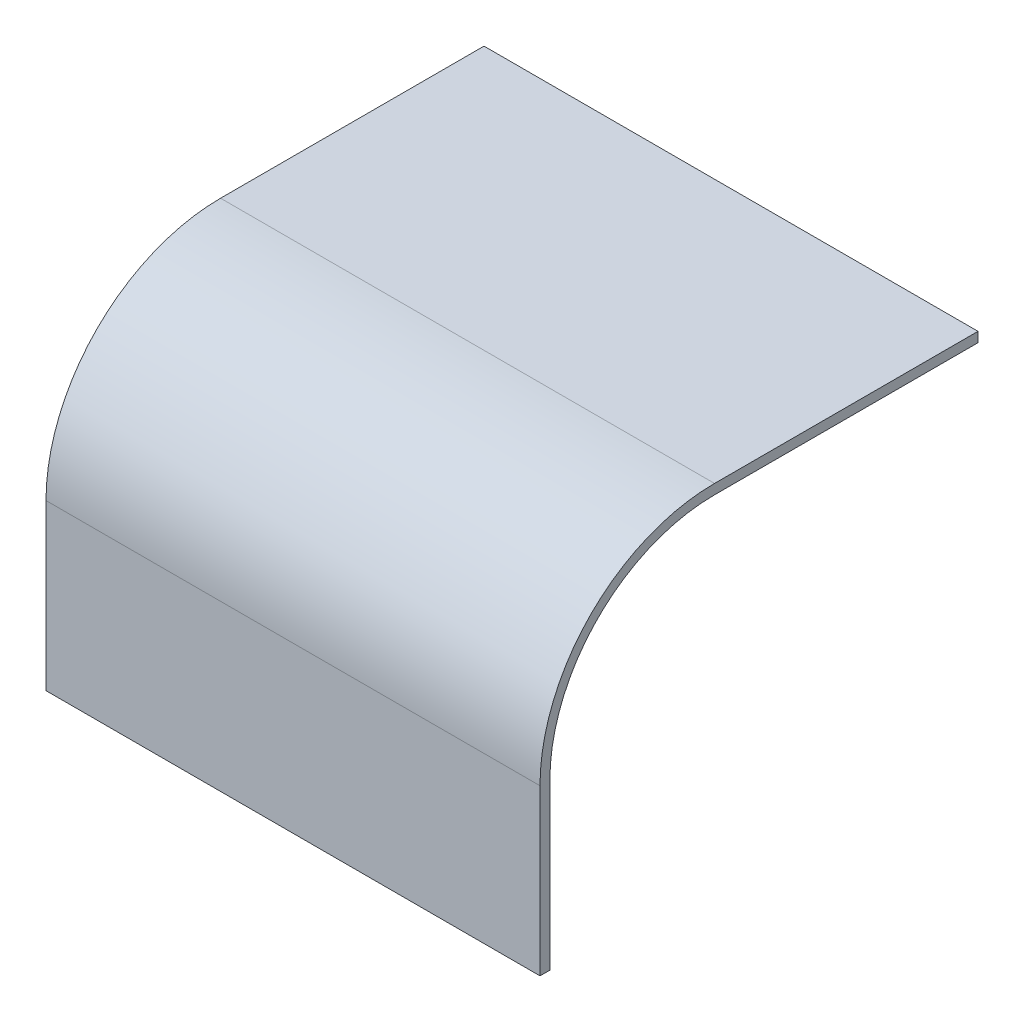
ISO-10303-21;
HEADER;
FILE_DESCRIPTION(('STEP AP214'),'2;1');
FILE_NAME('part.step','',(''),(''),'','','');
FILE_SCHEMA(('AUTOMOTIVE_DESIGN { 1 0 10303 214 1 1 1 1 }'));
ENDSEC;
DATA;
#1=APPLICATION_CONTEXT('core data for automotive mechanical design processes');
#2=APPLICATION_PROTOCOL_DEFINITION('international standard','automotive_design',2000,#1);
#3=PRODUCT_CONTEXT('',#1,'mechanical');
#4=PRODUCT('Part','Part','',(#3));
#5=PRODUCT_RELATED_PRODUCT_CATEGORY('part','',(#4));
#6=PRODUCT_DEFINITION_FORMATION('','',#4);
#7=PRODUCT_DEFINITION_CONTEXT('part definition',#1,'design');
#8=PRODUCT_DEFINITION('design','',#6,#7);
#9=PRODUCT_DEFINITION_SHAPE('','',#8);
#10=(LENGTH_UNIT() NAMED_UNIT(*) SI_UNIT(.MILLI.,.METRE.));
#11=(NAMED_UNIT(*) PLANE_ANGLE_UNIT() SI_UNIT($,.RADIAN.));
#12=(NAMED_UNIT(*) SI_UNIT($,.STERADIAN.) SOLID_ANGLE_UNIT());
#13=UNCERTAINTY_MEASURE_WITH_UNIT(LENGTH_MEASURE(1.E-05),#10,'distance_accuracy_value','');
#14=(GEOMETRIC_REPRESENTATION_CONTEXT(3) GLOBAL_UNCERTAINTY_ASSIGNED_CONTEXT((#13)) GLOBAL_UNIT_ASSIGNED_CONTEXT((#10,
#11,#12)) REPRESENTATION_CONTEXT('',''));
#15=CARTESIAN_POINT('',(0.,0.,0.));
#16=DIRECTION('',(0.,0.,1.));
#17=DIRECTION('',(1.,0.,0.));
#18=AXIS2_PLACEMENT_3D('',#15,#16,#17);
#19=CARTESIAN_POINT('',(67.6943061130725,17.5432803309073,1020.92625475085));
#20=DIRECTION('',(-1.,0.,0.));
#21=DIRECTION('',(0.,0.,1.));
#22=AXIS2_PLACEMENT_3D('',#19,#20,#21);
#23=CYLINDRICAL_SURFACE('',#22,50.);
#24=CARTESIAN_POINT('',(-82.3056938869275,17.5432803309073,1020.92625475085));
#25=DIRECTION('',(-1.,0.,0.));
#26=DIRECTION('',(0.,0.,-1.));
#27=AXIS2_PLACEMENT_3D('',#24,#25,#26);
#28=CIRCLE('',#27,50.);
#29=CARTESIAN_POINT('',(-82.3056938869275,17.5432803309073,1070.92625475085));
#30=VERTEX_POINT('',#29);
#31=CARTESIAN_POINT('',(-82.3056938869275,67.5432803309073,1020.92625475085));
#32=VERTEX_POINT('',#31);
#33=EDGE_CURVE('E147',#30,#32,#28,.T.);
#34=ORIENTED_EDGE('',*,*,#33,.T.);
#35=DIRECTION('',(-1.,0.,0.));
#36=VECTOR('',#35,1.);
#37=CARTESIAN_POINT('',(67.6943061130725,67.5432803309073,1020.92625475085));
#38=LINE('',#37,#36);
#39=CARTESIAN_POINT('',(67.6943061130725,67.5432803309073,1020.92625475085));
#40=VERTEX_POINT('',#39);
#41=EDGE_CURVE('E11',#40,#32,#38,.T.);
#42=ORIENTED_EDGE('',*,*,#41,.F.);
#43=CARTESIAN_POINT('',(67.6943061130725,17.5432803309073,1020.92625475085));
#44=DIRECTION('',(-1.,0.,0.));
#45=DIRECTION('',(0.,0.,-1.));
#46=AXIS2_PLACEMENT_3D('',#43,#44,#45);
#47=CIRCLE('',#46,50.);
#48=CARTESIAN_POINT('',(67.6943061130725,17.5432803309073,1070.92625475085));
#49=VERTEX_POINT('',#48);
#50=EDGE_CURVE('E166',#49,#40,#47,.T.);
#51=ORIENTED_EDGE('',*,*,#50,.F.);
#52=DIRECTION('',(-1.,0.,0.));
#53=VECTOR('',#52,1.);
#54=CARTESIAN_POINT('',(67.6943061130725,17.5432803309073,1070.92625475085));
#55=LINE('',#54,#53);
#56=EDGE_CURVE('E145',#49,#30,#55,.T.);
#57=ORIENTED_EDGE('',*,*,#56,.T.);
#58=EDGE_LOOP('',(#34,#42,#51,#57));
#59=FACE_BOUND('',#58,.T.);
#60=ADVANCED_FACE('F44',(#59),#23,.F.);
#61=CARTESIAN_POINT('',(67.6943061130725,67.5432803309073,1020.92625475085));
#62=DIRECTION('',(0.,1.,0.));
#63=DIRECTION('',(0.,0.,1.));
#64=AXIS2_PLACEMENT_3D('',#61,#62,#63);
#65=PLANE('',#64);
#66=DIRECTION('',(0.,0.,-1.));
#67=VECTOR('',#66,1.);
#68=CARTESIAN_POINT('',(-82.3056938869275,67.5432803309073,1020.92625475085));
#69=LINE('',#68,#67);
#70=CARTESIAN_POINT('',(-82.3056938869275,67.5432803309073,940.926254750851));
#71=VERTEX_POINT('',#70);
#72=EDGE_CURVE('E148',#32,#71,#69,.T.);
#73=ORIENTED_EDGE('',*,*,#72,.T.);
#74=DIRECTION('',(-1.,0.,0.));
#75=VECTOR('',#74,1.);
#76=CARTESIAN_POINT('',(67.6943061130725,67.5432803309073,940.926254750851));
#77=LINE('',#76,#75);
#78=CARTESIAN_POINT('',(67.6943061130725,67.5432803309073,940.926254750851));
#79=VERTEX_POINT('',#78);
#80=EDGE_CURVE('E53',#79,#71,#77,.T.);
#81=ORIENTED_EDGE('',*,*,#80,.F.);
#82=DIRECTION('',(0.,0.,-1.));
#83=VECTOR('',#82,1.);
#84=CARTESIAN_POINT('',(67.6943061130725,67.5432803309073,1020.92625475085));
#85=LINE('',#84,#83);
#86=EDGE_CURVE('E103',#40,#79,#85,.T.);
#87=ORIENTED_EDGE('',*,*,#86,.F.);
#88=ORIENTED_EDGE('',*,*,#41,.T.);
#89=EDGE_LOOP('',(#73,#81,#87,#88));
#90=FACE_BOUND('',#89,.T.);
#91=ADVANCED_FACE('F215',(#90),#65,.F.);
#92=CARTESIAN_POINT('',(67.6943061130725,70.5432803309073,940.926254750851));
#93=DIRECTION('',(0.,0.,1.));
#94=DIRECTION('',(1.,0.,0.));
#95=AXIS2_PLACEMENT_3D('',#92,#93,#94);
#96=PLANE('',#95);
#97=DIRECTION('',(0.,1.,0.));
#98=VECTOR('',#97,1.);
#99=CARTESIAN_POINT('',(-82.3056938869275,70.5432803309073,940.926254750851));
#100=LINE('',#99,#98);
#101=CARTESIAN_POINT('',(-82.3056938869275,70.5432803309073,940.926254750851));
#102=VERTEX_POINT('',#101);
#103=EDGE_CURVE('E154',#71,#102,#100,.T.);
#104=ORIENTED_EDGE('',*,*,#103,.T.);
#105=DIRECTION('',(-1.,0.,0.));
#106=VECTOR('',#105,1.);
#107=CARTESIAN_POINT('',(67.6943061130725,70.5432803309073,940.926254750851));
#108=LINE('',#107,#106);
#109=CARTESIAN_POINT('',(67.6943061130725,70.5432803309073,940.926254750851));
#110=VERTEX_POINT('',#109);
#111=EDGE_CURVE('E177',#110,#102,#108,.T.);
#112=ORIENTED_EDGE('',*,*,#111,.F.);
#113=DIRECTION('',(0.,1.,0.));
#114=VECTOR('',#113,1.);
#115=CARTESIAN_POINT('',(67.6943061130725,70.5432803309073,940.926254750851));
#116=LINE('',#115,#114);
#117=EDGE_CURVE('E188',#79,#110,#116,.T.);
#118=ORIENTED_EDGE('',*,*,#117,.F.);
#119=ORIENTED_EDGE('',*,*,#80,.T.);
#120=EDGE_LOOP('',(#104,#112,#118,#119));
#121=FACE_BOUND('',#120,.T.);
#122=ADVANCED_FACE('F190',(#121),#96,.F.);
#123=CARTESIAN_POINT('',(67.6943061130725,70.5432803309073,1020.92625475085));
#124=DIRECTION('',(0.,-1.,0.));
#125=DIRECTION('',(0.,0.,-1.));
#126=AXIS2_PLACEMENT_3D('',#123,#124,#125);
#127=PLANE('',#126);
#128=DIRECTION('',(0.,0.,1.));
#129=VECTOR('',#128,1.);
#130=CARTESIAN_POINT('',(-82.3056938869275,70.5432803309073,1020.92625475085));
#131=LINE('',#130,#129);
#132=CARTESIAN_POINT('',(-82.3056938869275,70.5432803309073,1020.92625475085));
#133=VERTEX_POINT('',#132);
#134=EDGE_CURVE('E157',#102,#133,#131,.T.);
#135=ORIENTED_EDGE('',*,*,#134,.T.);
#136=DIRECTION('',(-1.,0.,0.));
#137=VECTOR('',#136,1.);
#138=CARTESIAN_POINT('',(67.6943061130725,70.5432803309073,1020.92625475085));
#139=LINE('',#138,#137);
#140=CARTESIAN_POINT('',(67.6943061130725,70.5432803309073,1020.92625475085));
#141=VERTEX_POINT('',#140);
#142=EDGE_CURVE('E172',#141,#133,#139,.T.);
#143=ORIENTED_EDGE('',*,*,#142,.F.);
#144=DIRECTION('',(0.,0.,1.));
#145=VECTOR('',#144,1.);
#146=CARTESIAN_POINT('',(67.6943061130725,70.5432803309073,1020.92625475085));
#147=LINE('',#146,#145);
#148=EDGE_CURVE('E205',#110,#141,#147,.T.);
#149=ORIENTED_EDGE('',*,*,#148,.F.);
#150=ORIENTED_EDGE('',*,*,#111,.T.);
#151=EDGE_LOOP('',(#135,#143,#149,#150));
#152=FACE_BOUND('',#151,.T.);
#153=ADVANCED_FACE('F197',(#152),#127,.F.);
#154=CARTESIAN_POINT('',(67.6943061130725,17.5432803309073,1020.92625475085));
#155=DIRECTION('',(-1.,0.,0.));
#156=DIRECTION('',(0.,0.,1.));
#157=AXIS2_PLACEMENT_3D('',#154,#155,#156);
#158=CYLINDRICAL_SURFACE('',#157,53.);
#159=CARTESIAN_POINT('',(-82.3056938869275,17.5432803309073,1020.92625475085));
#160=DIRECTION('',(1.,0.,0.));
#161=DIRECTION('',(0.,0.,-1.));
#162=AXIS2_PLACEMENT_3D('',#159,#160,#161);
#163=CIRCLE('',#162,53.);
#164=CARTESIAN_POINT('',(-82.3056938869275,17.5432803309073,1073.92625475085));
#165=VERTEX_POINT('',#164);
#166=EDGE_CURVE('E159',#133,#165,#163,.T.);
#167=ORIENTED_EDGE('',*,*,#166,.T.);
#168=DIRECTION('',(-1.,0.,0.));
#169=VECTOR('',#168,1.);
#170=CARTESIAN_POINT('',(67.6943061130725,17.5432803309073,1073.92625475085));
#171=LINE('',#170,#169);
#172=CARTESIAN_POINT('',(67.6943061130725,17.5432803309073,1073.92625475085));
#173=VERTEX_POINT('',#172);
#174=EDGE_CURVE('E134',#173,#165,#171,.T.);
#175=ORIENTED_EDGE('',*,*,#174,.F.);
#176=CARTESIAN_POINT('',(67.6943061130725,17.5432803309073,1020.92625475085));
#177=DIRECTION('',(1.,0.,0.));
#178=DIRECTION('',(0.,0.,-1.));
#179=AXIS2_PLACEMENT_3D('',#176,#177,#178);
#180=CIRCLE('',#179,53.);
#181=EDGE_CURVE('E125',#141,#173,#180,.T.);
#182=ORIENTED_EDGE('',*,*,#181,.F.);
#183=ORIENTED_EDGE('',*,*,#142,.T.);
#184=EDGE_LOOP('',(#167,#175,#182,#183));
#185=FACE_BOUND('',#184,.T.);
#186=ADVANCED_FACE('F200',(#185),#158,.T.);
#187=CARTESIAN_POINT('',(67.6943061130725,-32.4567196690927,1073.92625475085));
#188=DIRECTION('',(0.,0.,-1.));
#189=DIRECTION('',(-1.,0.,0.));
#190=AXIS2_PLACEMENT_3D('',#187,#188,#189);
#191=PLANE('',#190);
#192=DIRECTION('',(0.,-1.,0.));
#193=VECTOR('',#192,1.);
#194=CARTESIAN_POINT('',(-82.3056938869275,-32.4567196690927,1073.92625475085));
#195=LINE('',#194,#193);
#196=CARTESIAN_POINT('',(-82.3056938869275,-32.4567196690927,1073.92625475085));
#197=VERTEX_POINT('',#196);
#198=EDGE_CURVE('E133',#165,#197,#195,.T.);
#199=ORIENTED_EDGE('',*,*,#198,.T.);
#200=DIRECTION('',(-1.,0.,0.));
#201=VECTOR('',#200,1.);
#202=CARTESIAN_POINT('',(67.6943061130725,-32.4567196690927,1073.92625475085));
#203=LINE('',#202,#201);
#204=CARTESIAN_POINT('',(67.6943061130725,-32.4567196690927,1073.92625475085));
#205=VERTEX_POINT('',#204);
#206=EDGE_CURVE('E127',#205,#197,#203,.T.);
#207=ORIENTED_EDGE('',*,*,#206,.F.);
#208=DIRECTION('',(0.,-1.,0.));
#209=VECTOR('',#208,1.);
#210=CARTESIAN_POINT('',(67.6943061130725,-32.4567196690927,1073.92625475085));
#211=LINE('',#210,#209);
#212=EDGE_CURVE('E119',#173,#205,#211,.T.);
#213=ORIENTED_EDGE('',*,*,#212,.F.);
#214=ORIENTED_EDGE('',*,*,#174,.T.);
#215=EDGE_LOOP('',(#199,#207,#213,#214));
#216=FACE_BOUND('',#215,.T.);
#217=ADVANCED_FACE('F131',(#216),#191,.F.);
#218=CARTESIAN_POINT('',(67.6943061130725,-32.4567196690927,1073.92625475085));
#219=DIRECTION('',(0.,1.,0.));
#220=DIRECTION('',(0.,0.,1.));
#221=AXIS2_PLACEMENT_3D('',#218,#219,#220);
#222=PLANE('',#221);
#223=DIRECTION('',(0.,0.,-1.));
#224=VECTOR('',#223,1.);
#225=CARTESIAN_POINT('',(-82.3056938869275,-32.4567196690927,1073.92625475085));
#226=LINE('',#225,#224);
#227=CARTESIAN_POINT('',(-82.3056938869275,-32.4567196690927,1070.92625475085));
#228=VERTEX_POINT('',#227);
#229=EDGE_CURVE('E91',#197,#228,#226,.T.);
#230=ORIENTED_EDGE('',*,*,#229,.T.);
#231=DIRECTION('',(-1.,0.,0.));
#232=VECTOR('',#231,1.);
#233=CARTESIAN_POINT('',(67.6943061130725,-32.4567196690927,1070.92625475085));
#234=LINE('',#233,#232);
#235=CARTESIAN_POINT('',(67.6943061130725,-32.4567196690927,1070.92625475085));
#236=VERTEX_POINT('',#235);
#237=EDGE_CURVE('E136',#236,#228,#234,.T.);
#238=ORIENTED_EDGE('',*,*,#237,.F.);
#239=DIRECTION('',(0.,0.,-1.));
#240=VECTOR('',#239,1.);
#241=CARTESIAN_POINT('',(67.6943061130725,-32.4567196690927,1073.92625475085));
#242=LINE('',#241,#240);
#243=EDGE_CURVE('E122',#205,#236,#242,.T.);
#244=ORIENTED_EDGE('',*,*,#243,.F.);
#245=ORIENTED_EDGE('',*,*,#206,.T.);
#246=EDGE_LOOP('',(#230,#238,#244,#245));
#247=FACE_BOUND('',#246,.T.);
#248=ADVANCED_FACE('F138',(#247),#222,.F.);
#249=CARTESIAN_POINT('',(67.6943061130725,-32.4567196690927,1070.92625475085));
#250=DIRECTION('',(0.,0.,1.));
#251=DIRECTION('',(1.,0.,0.));
#252=AXIS2_PLACEMENT_3D('',#249,#250,#251);
#253=PLANE('',#252);
#254=DIRECTION('',(0.,1.,0.));
#255=VECTOR('',#254,1.);
#256=CARTESIAN_POINT('',(-82.3056938869275,-32.4567196690927,1070.92625475085));
#257=LINE('',#256,#255);
#258=EDGE_CURVE('E100',#228,#30,#257,.T.);
#259=ORIENTED_EDGE('',*,*,#258,.T.);
#260=ORIENTED_EDGE('',*,*,#56,.F.);
#261=DIRECTION('',(0.,1.,0.));
#262=VECTOR('',#261,1.);
#263=CARTESIAN_POINT('',(67.6943061130725,-32.4567196690927,1070.92625475085));
#264=LINE('',#263,#262);
#265=EDGE_CURVE('E62',#236,#49,#264,.T.);
#266=ORIENTED_EDGE('',*,*,#265,.F.);
#267=ORIENTED_EDGE('',*,*,#237,.T.);
#268=EDGE_LOOP('',(#259,#260,#266,#267));
#269=FACE_BOUND('',#268,.T.);
#270=ADVANCED_FACE('F229',(#269),#253,.F.);
#271=CARTESIAN_POINT('',(67.6943061130725,17.5432803309073,1020.92625475085));
#272=DIRECTION('',(1.,0.,0.));
#273=DIRECTION('',(0.,0.,-1.));
#274=AXIS2_PLACEMENT_3D('',#271,#272,#273);
#275=PLANE('',#274);
#276=ORIENTED_EDGE('',*,*,#50,.T.);
#277=ORIENTED_EDGE('',*,*,#86,.T.);
#278=ORIENTED_EDGE('',*,*,#117,.T.);
#279=ORIENTED_EDGE('',*,*,#148,.T.);
#280=ORIENTED_EDGE('',*,*,#181,.T.);
#281=ORIENTED_EDGE('',*,*,#212,.T.);
#282=ORIENTED_EDGE('',*,*,#243,.T.);
#283=ORIENTED_EDGE('',*,*,#265,.T.);
#284=EDGE_LOOP('',(#276,#277,#278,#279,#280,#281,#282,#283));
#285=FACE_BOUND('',#284,.T.);
#286=ADVANCED_FACE('F120',(#285),#275,.T.);
#287=CARTESIAN_POINT('',(-82.3056938869275,17.5432803309073,1020.92625475085));
#288=DIRECTION('',(1.,0.,0.));
#289=DIRECTION('',(0.,0.,-1.));
#290=AXIS2_PLACEMENT_3D('',#287,#288,#289);
#291=PLANE('',#290);
#292=ORIENTED_EDGE('',*,*,#33,.F.);
#293=ORIENTED_EDGE('',*,*,#258,.F.);
#294=ORIENTED_EDGE('',*,*,#229,.F.);
#295=ORIENTED_EDGE('',*,*,#198,.F.);
#296=ORIENTED_EDGE('',*,*,#166,.F.);
#297=ORIENTED_EDGE('',*,*,#134,.F.);
#298=ORIENTED_EDGE('',*,*,#103,.F.);
#299=ORIENTED_EDGE('',*,*,#72,.F.);
#300=EDGE_LOOP('',(#292,#293,#294,#295,#296,#297,#298,#299));
#301=FACE_BOUND('',#300,.T.);
#302=ADVANCED_FACE('F194',(#301),#291,.F.);
#303=CLOSED_SHELL('',(#60,#91,#122,#153,#186,#217,#248,#270,#286,#302));
#304=MANIFOLD_SOLID_BREP('B2',#303);
#305=ADVANCED_BREP_SHAPE_REPRESENTATION('',(#18,#304),#14);
#306=SHAPE_DEFINITION_REPRESENTATION(#9,#305);
ENDSEC;
END-ISO-10303-21;
